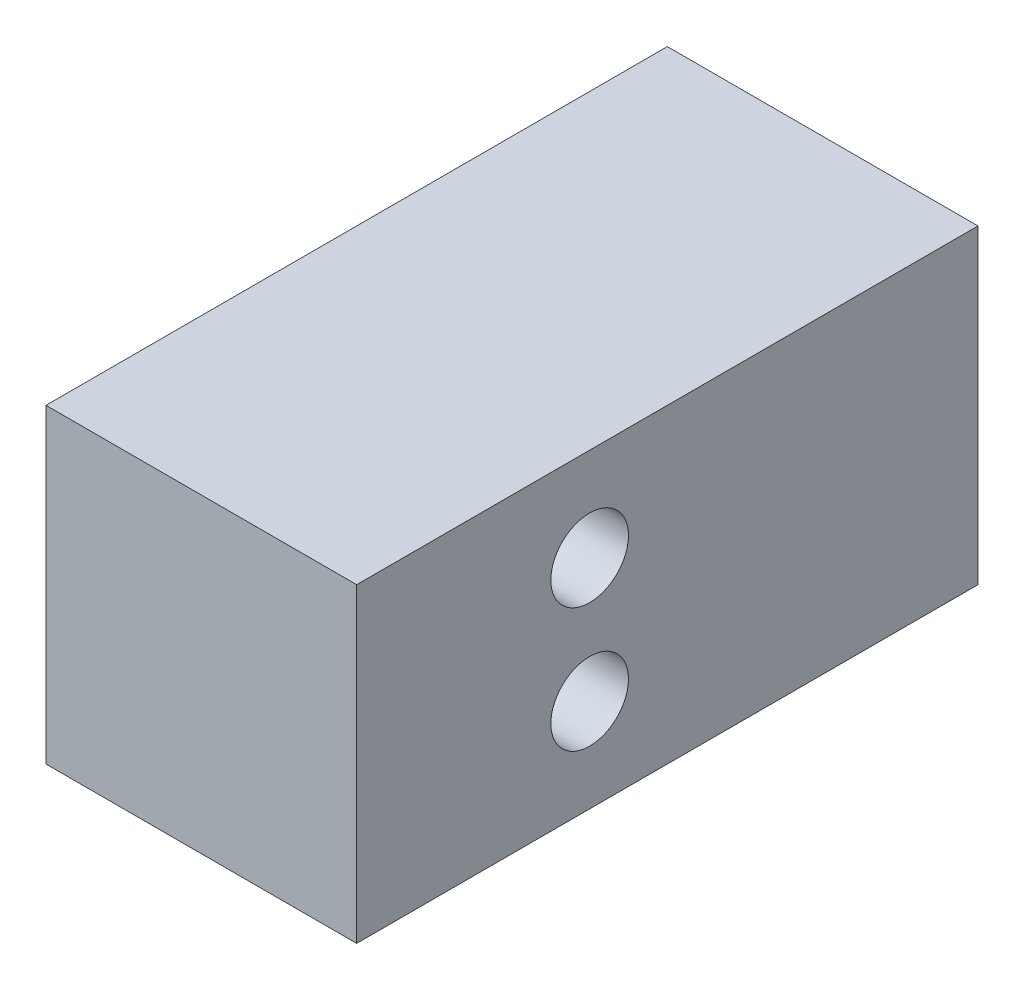
ISO-10303-21;
HEADER;
FILE_DESCRIPTION(('STEP AP214'),'2;1');
FILE_NAME('part.step','',(''),(''),'','','');
FILE_SCHEMA(('AUTOMOTIVE_DESIGN { 1 0 10303 214 1 1 1 1 }'));
ENDSEC;
DATA;
#1=APPLICATION_CONTEXT('core data for automotive mechanical design processes');
#2=APPLICATION_PROTOCOL_DEFINITION('international standard','automotive_design',2000,#1);
#3=PRODUCT_CONTEXT('',#1,'mechanical');
#4=PRODUCT('Part','Part','',(#3));
#5=PRODUCT_RELATED_PRODUCT_CATEGORY('part','',(#4));
#6=PRODUCT_DEFINITION_FORMATION('','',#4);
#7=PRODUCT_DEFINITION_CONTEXT('part definition',#1,'design');
#8=PRODUCT_DEFINITION('design','',#6,#7);
#9=PRODUCT_DEFINITION_SHAPE('','',#8);
#10=(LENGTH_UNIT() NAMED_UNIT(*) SI_UNIT(.MILLI.,.METRE.));
#11=(NAMED_UNIT(*) PLANE_ANGLE_UNIT() SI_UNIT($,.RADIAN.));
#12=(NAMED_UNIT(*) SI_UNIT($,.STERADIAN.) SOLID_ANGLE_UNIT());
#13=UNCERTAINTY_MEASURE_WITH_UNIT(LENGTH_MEASURE(1.E-05),#10,'distance_accuracy_value','');
#14=(GEOMETRIC_REPRESENTATION_CONTEXT(3) GLOBAL_UNCERTAINTY_ASSIGNED_CONTEXT((#13)) GLOBAL_UNIT_ASSIGNED_CONTEXT((#10,
#11,#12)) REPRESENTATION_CONTEXT('',''));
#15=CARTESIAN_POINT('',(0.,0.,0.));
#16=DIRECTION('',(0.,0.,1.));
#17=DIRECTION('',(1.,0.,0.));
#18=AXIS2_PLACEMENT_3D('',#15,#16,#17);
#19=CARTESIAN_POINT('',(5.,5.,-20.));
#20=DIRECTION('',(1.,0.,0.));
#21=DIRECTION('',(0.,0.,-1.));
#22=AXIS2_PLACEMENT_3D('',#19,#20,#21);
#23=PLANE('',#22);
#24=CARTESIAN_POINT('',(5.,-2.,-7.5));
#25=DIRECTION('',(-1.,0.,0.));
#26=DIRECTION('',(0.,0.,-1.));
#27=AXIS2_PLACEMENT_3D('',#24,#25,#26);
#28=CIRCLE('',#27,1.25);
#29=CARTESIAN_POINT('',(5.,-2.,-8.75));
#30=VERTEX_POINT('',#29);
#31=EDGE_CURVE('E143',#30,#30,#28,.T.);
#32=ORIENTED_EDGE('',*,*,#31,.T.);
#33=EDGE_LOOP('',(#32));
#34=FACE_BOUND('',#33,.T.);
#35=CARTESIAN_POINT('',(5.,2.,-7.5));
#36=DIRECTION('',(1.,0.,0.));
#37=DIRECTION('',(0.,0.,-1.));
#38=AXIS2_PLACEMENT_3D('',#35,#36,#37);
#39=CIRCLE('',#38,1.25);
#40=CARTESIAN_POINT('',(5.,2.,-8.75));
#41=VERTEX_POINT('',#40);
#42=EDGE_CURVE('E145',#41,#41,#39,.T.);
#43=ORIENTED_EDGE('',*,*,#42,.F.);
#44=EDGE_LOOP('',(#43));
#45=FACE_BOUND('',#44,.T.);
#46=DIRECTION('',(0.,1.,0.));
#47=VECTOR('',#46,1.);
#48=CARTESIAN_POINT('',(5.,5.,0.));
#49=LINE('',#48,#47);
#50=CARTESIAN_POINT('',(5.,-5.,0.));
#51=VERTEX_POINT('',#50);
#52=CARTESIAN_POINT('',(5.,5.,0.));
#53=VERTEX_POINT('',#52);
#54=EDGE_CURVE('E97',#51,#53,#49,.T.);
#55=ORIENTED_EDGE('',*,*,#54,.F.);
#56=DIRECTION('',(0.,0.,1.));
#57=VECTOR('',#56,1.);
#58=CARTESIAN_POINT('',(5.,-5.,-20.));
#59=LINE('',#58,#57);
#60=CARTESIAN_POINT('',(5.,-5.,-20.));
#61=VERTEX_POINT('',#60);
#62=EDGE_CURVE('E11',#61,#51,#59,.T.);
#63=ORIENTED_EDGE('',*,*,#62,.F.);
#64=DIRECTION('',(0.,1.,0.));
#65=VECTOR('',#64,1.);
#66=CARTESIAN_POINT('',(5.,5.,-20.));
#67=LINE('',#66,#65);
#68=CARTESIAN_POINT('',(5.,5.,-20.));
#69=VERTEX_POINT('',#68);
#70=EDGE_CURVE('E90',#61,#69,#67,.T.);
#71=ORIENTED_EDGE('',*,*,#70,.T.);
#72=DIRECTION('',(0.,0.,1.));
#73=VECTOR('',#72,1.);
#74=CARTESIAN_POINT('',(5.,5.,-20.));
#75=LINE('',#74,#73);
#76=EDGE_CURVE('E35',#69,#53,#75,.T.);
#77=ORIENTED_EDGE('',*,*,#76,.T.);
#78=EDGE_LOOP('',(#55,#63,#71,#77));
#79=FACE_BOUND('',#78,.T.);
#80=ADVANCED_FACE('F32',(#34,#45,#79),#23,.T.);
#81=CARTESIAN_POINT('',(-4.99999999999999,-5.,-20.));
#82=DIRECTION('',(0.,-1.,0.));
#83=DIRECTION('',(0.,0.,-1.));
#84=AXIS2_PLACEMENT_3D('',#81,#82,#83);
#85=PLANE('',#84);
#86=DIRECTION('',(1.,0.,0.));
#87=VECTOR('',#86,1.);
#88=CARTESIAN_POINT('',(-4.99999999999999,-5.,0.));
#89=LINE('',#88,#87);
#90=CARTESIAN_POINT('',(-4.99999999999999,-5.,0.));
#91=VERTEX_POINT('',#90);
#92=EDGE_CURVE('E92',#91,#51,#89,.T.);
#93=ORIENTED_EDGE('',*,*,#92,.F.);
#94=DIRECTION('',(0.,0.,1.));
#95=VECTOR('',#94,1.);
#96=CARTESIAN_POINT('',(-4.99999999999999,-5.,-20.));
#97=LINE('',#96,#95);
#98=CARTESIAN_POINT('',(-4.99999999999999,-5.,-20.));
#99=VERTEX_POINT('',#98);
#100=EDGE_CURVE('E41',#99,#91,#97,.T.);
#101=ORIENTED_EDGE('',*,*,#100,.F.);
#102=DIRECTION('',(1.,0.,0.));
#103=VECTOR('',#102,1.);
#104=CARTESIAN_POINT('',(-4.99999999999999,-5.,-20.));
#105=LINE('',#104,#103);
#106=EDGE_CURVE('E87',#99,#61,#105,.T.);
#107=ORIENTED_EDGE('',*,*,#106,.T.);
#108=ORIENTED_EDGE('',*,*,#62,.T.);
#109=EDGE_LOOP('',(#93,#101,#107,#108));
#110=FACE_BOUND('',#109,.T.);
#111=ADVANCED_FACE('F108',(#110),#85,.T.);
#112=CARTESIAN_POINT('',(-5.,5.,-20.));
#113=DIRECTION('',(-1.,0.,0.));
#114=DIRECTION('',(0.,-1.,0.));
#115=AXIS2_PLACEMENT_3D('',#112,#113,#114);
#116=PLANE('',#115);
#117=CARTESIAN_POINT('',(-5.,-2.,-7.5));
#118=DIRECTION('',(-1.,0.,0.));
#119=DIRECTION('',(0.,0.,-1.));
#120=AXIS2_PLACEMENT_3D('',#117,#118,#119);
#121=CIRCLE('',#120,1.25);
#122=CARTESIAN_POINT('',(-5.,-2.,-8.75));
#123=VERTEX_POINT('',#122);
#124=EDGE_CURVE('E140',#123,#123,#121,.T.);
#125=ORIENTED_EDGE('',*,*,#124,.F.);
#126=EDGE_LOOP('',(#125));
#127=FACE_BOUND('',#126,.T.);
#128=CARTESIAN_POINT('',(-5.,2.,-7.5));
#129=DIRECTION('',(1.,0.,0.));
#130=DIRECTION('',(0.,0.,-1.));
#131=AXIS2_PLACEMENT_3D('',#128,#129,#130);
#132=CIRCLE('',#131,1.25);
#133=CARTESIAN_POINT('',(-5.,2.,-8.75));
#134=VERTEX_POINT('',#133);
#135=EDGE_CURVE('E101',#134,#134,#132,.T.);
#136=ORIENTED_EDGE('',*,*,#135,.T.);
#137=EDGE_LOOP('',(#136));
#138=FACE_BOUND('',#137,.T.);
#139=DIRECTION('',(0.,-1.,0.));
#140=VECTOR('',#139,1.);
#141=CARTESIAN_POINT('',(-5.,5.,0.));
#142=LINE('',#141,#140);
#143=CARTESIAN_POINT('',(-5.,5.,0.));
#144=VERTEX_POINT('',#143);
#145=EDGE_CURVE('E82',#144,#91,#142,.T.);
#146=ORIENTED_EDGE('',*,*,#145,.F.);
#147=DIRECTION('',(0.,0.,1.));
#148=VECTOR('',#147,1.);
#149=CARTESIAN_POINT('',(-5.,5.,-20.));
#150=LINE('',#149,#148);
#151=CARTESIAN_POINT('',(-5.,5.,-20.));
#152=VERTEX_POINT('',#151);
#153=EDGE_CURVE('E77',#152,#144,#150,.T.);
#154=ORIENTED_EDGE('',*,*,#153,.F.);
#155=DIRECTION('',(0.,-1.,0.));
#156=VECTOR('',#155,1.);
#157=CARTESIAN_POINT('',(-5.,5.,-20.));
#158=LINE('',#157,#156);
#159=EDGE_CURVE('E80',#152,#99,#158,.T.);
#160=ORIENTED_EDGE('',*,*,#159,.T.);
#161=ORIENTED_EDGE('',*,*,#100,.T.);
#162=EDGE_LOOP('',(#146,#154,#160,#161));
#163=FACE_BOUND('',#162,.T.);
#164=ADVANCED_FACE('F79',(#127,#138,#163),#116,.T.);
#165=CARTESIAN_POINT('',(-5.,5.,-20.));
#166=DIRECTION('',(0.,1.,0.));
#167=DIRECTION('',(0.,0.,1.));
#168=AXIS2_PLACEMENT_3D('',#165,#166,#167);
#169=PLANE('',#168);
#170=DIRECTION('',(-1.,0.,0.));
#171=VECTOR('',#170,1.);
#172=CARTESIAN_POINT('',(-5.,5.,0.));
#173=LINE('',#172,#171);
#174=EDGE_CURVE('E100',#53,#144,#173,.T.);
#175=ORIENTED_EDGE('',*,*,#174,.F.);
#176=ORIENTED_EDGE('',*,*,#76,.F.);
#177=DIRECTION('',(-1.,0.,0.));
#178=VECTOR('',#177,1.);
#179=CARTESIAN_POINT('',(-5.,5.,-20.));
#180=LINE('',#179,#178);
#181=EDGE_CURVE('E86',#69,#152,#180,.T.);
#182=ORIENTED_EDGE('',*,*,#181,.T.);
#183=ORIENTED_EDGE('',*,*,#153,.T.);
#184=EDGE_LOOP('',(#175,#176,#182,#183));
#185=FACE_BOUND('',#184,.T.);
#186=ADVANCED_FACE('F89',(#185),#169,.T.);
#187=CARTESIAN_POINT('',(0.,0.,-20.));
#188=DIRECTION('',(0.,0.,1.));
#189=DIRECTION('',(1.,0.,0.));
#190=AXIS2_PLACEMENT_3D('',#187,#188,#189);
#191=PLANE('',#190);
#192=ORIENTED_EDGE('',*,*,#70,.F.);
#193=ORIENTED_EDGE('',*,*,#106,.F.);
#194=ORIENTED_EDGE('',*,*,#159,.F.);
#195=ORIENTED_EDGE('',*,*,#181,.F.);
#196=EDGE_LOOP('',(#192,#193,#194,#195));
#197=FACE_BOUND('',#196,.T.);
#198=ADVANCED_FACE('F85',(#197),#191,.F.);
#199=CARTESIAN_POINT('',(0.,0.,0.));
#200=DIRECTION('',(0.,0.,1.));
#201=DIRECTION('',(1.,0.,0.));
#202=AXIS2_PLACEMENT_3D('',#199,#200,#201);
#203=PLANE('',#202);
#204=ORIENTED_EDGE('',*,*,#54,.T.);
#205=ORIENTED_EDGE('',*,*,#174,.T.);
#206=ORIENTED_EDGE('',*,*,#145,.T.);
#207=ORIENTED_EDGE('',*,*,#92,.T.);
#208=EDGE_LOOP('',(#204,#205,#206,#207));
#209=FACE_BOUND('',#208,.T.);
#210=ADVANCED_FACE('F107',(#209),#203,.T.);
#211=CARTESIAN_POINT('',(-5.,2.,-7.5));
#212=DIRECTION('',(1.,0.,0.));
#213=DIRECTION('',(0.,0.,-1.));
#214=AXIS2_PLACEMENT_3D('',#211,#212,#213);
#215=CYLINDRICAL_SURFACE('',#214,1.25);
#216=ORIENTED_EDGE('',*,*,#135,.F.);
#217=EDGE_LOOP('',(#216));
#218=FACE_BOUND('',#217,.T.);
#219=ORIENTED_EDGE('',*,*,#42,.T.);
#220=EDGE_LOOP('',(#219));
#221=FACE_BOUND('',#220,.T.);
#222=ADVANCED_FACE('F127',(#218,#221),#215,.F.);
#223=CARTESIAN_POINT('',(-5.,-2.,-7.5));
#224=DIRECTION('',(1.,0.,0.));
#225=DIRECTION('',(0.,0.,-1.));
#226=AXIS2_PLACEMENT_3D('',#223,#224,#225);
#227=CYLINDRICAL_SURFACE('',#226,1.25);
#228=ORIENTED_EDGE('',*,*,#124,.T.);
#229=EDGE_LOOP('',(#228));
#230=FACE_BOUND('',#229,.T.);
#231=ORIENTED_EDGE('',*,*,#31,.F.);
#232=EDGE_LOOP('',(#231));
#233=FACE_BOUND('',#232,.T.);
#234=ADVANCED_FACE('F131',(#230,#233),#227,.F.);
#235=CLOSED_SHELL('',(#80,#111,#164,#186,#198,#210,#222,#234));
#236=MANIFOLD_SOLID_BREP('B2',#235);
#237=ADVANCED_BREP_SHAPE_REPRESENTATION('',(#18,#236),#14);
#238=SHAPE_DEFINITION_REPRESENTATION(#9,#237);
ENDSEC;
END-ISO-10303-21;
